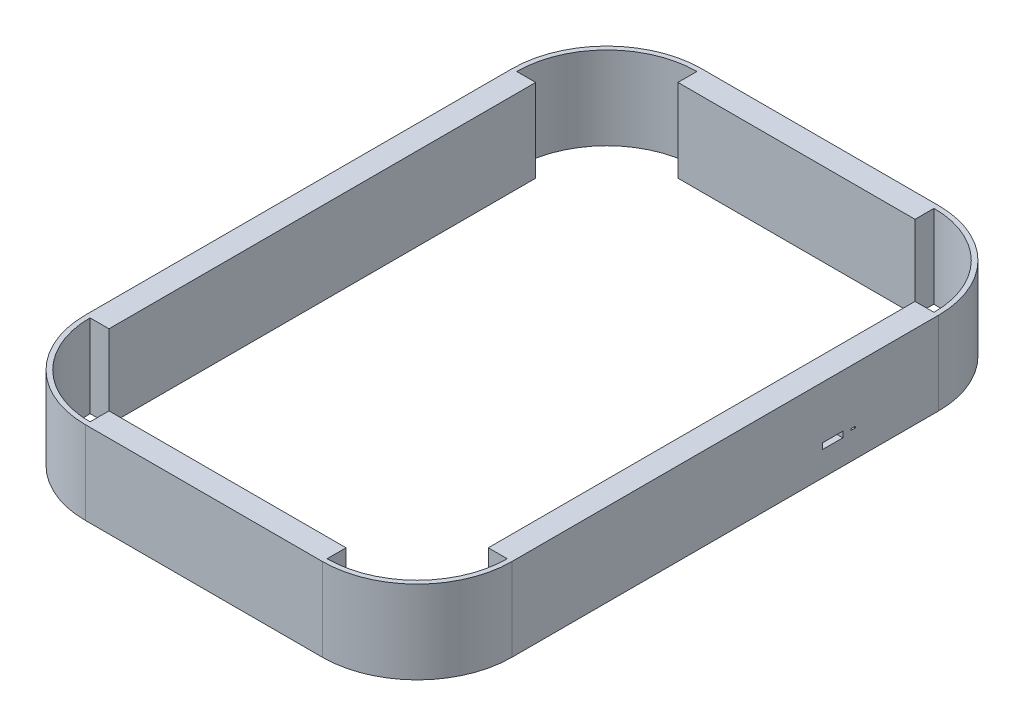
ISO-10303-21;
HEADER;
FILE_DESCRIPTION(('STEP AP214'),'2;1');
FILE_NAME('part.step','',(''),(''),'','','');
FILE_SCHEMA(('AUTOMOTIVE_DESIGN { 1 0 10303 214 1 1 1 1 }'));
ENDSEC;
DATA;
#1=APPLICATION_CONTEXT('core data for automotive mechanical design processes');
#2=APPLICATION_PROTOCOL_DEFINITION('international standard','automotive_design',2000,#1);
#3=PRODUCT_CONTEXT('',#1,'mechanical');
#4=PRODUCT('Part','Part','',(#3));
#5=PRODUCT_RELATED_PRODUCT_CATEGORY('part','',(#4));
#6=PRODUCT_DEFINITION_FORMATION('','',#4);
#7=PRODUCT_DEFINITION_CONTEXT('part definition',#1,'design');
#8=PRODUCT_DEFINITION('design','',#6,#7);
#9=PRODUCT_DEFINITION_SHAPE('','',#8);
#10=(LENGTH_UNIT() NAMED_UNIT(*) SI_UNIT(.MILLI.,.METRE.));
#11=(NAMED_UNIT(*) PLANE_ANGLE_UNIT() SI_UNIT($,.RADIAN.));
#12=(NAMED_UNIT(*) SI_UNIT($,.STERADIAN.) SOLID_ANGLE_UNIT());
#13=UNCERTAINTY_MEASURE_WITH_UNIT(LENGTH_MEASURE(1.E-05),#10,'distance_accuracy_value','');
#14=(GEOMETRIC_REPRESENTATION_CONTEXT(3) GLOBAL_UNCERTAINTY_ASSIGNED_CONTEXT((#13)) GLOBAL_UNIT_ASSIGNED_CONTEXT((#10,
#11,#12)) REPRESENTATION_CONTEXT('',''));
#15=CARTESIAN_POINT('',(0.,0.,0.));
#16=DIRECTION('',(0.,0.,1.));
#17=DIRECTION('',(1.,0.,0.));
#18=AXIS2_PLACEMENT_3D('',#15,#16,#17);
#19=CARTESIAN_POINT('',(-80.,35.,120.));
#20=DIRECTION('',(0.,0.,-1.));
#21=DIRECTION('',(-1.,0.,0.));
#22=AXIS2_PLACEMENT_3D('',#19,#20,#21);
#23=PLANE('',#22);
#24=DIRECTION('',(1.,0.,0.));
#25=VECTOR('',#24,1.);
#26=CARTESIAN_POINT('',(-80.,0.,120.));
#27=LINE('',#26,#25);
#28=CARTESIAN_POINT('',(-50.,0.,120.));
#29=VERTEX_POINT('',#28);
#30=CARTESIAN_POINT('',(50.,0.,120.));
#31=VERTEX_POINT('',#30);
#32=EDGE_CURVE('E400',#29,#31,#27,.T.);
#33=ORIENTED_EDGE('',*,*,#32,.F.);
#34=DIRECTION('',(0.,-1.,0.));
#35=VECTOR('',#34,1.);
#36=CARTESIAN_POINT('',(-50.,35.,120.));
#37=LINE('',#36,#35);
#38=CARTESIAN_POINT('',(-50.,35.,120.));
#39=VERTEX_POINT('',#38);
#40=EDGE_CURVE('E429',#39,#29,#37,.T.);
#41=ORIENTED_EDGE('',*,*,#40,.F.);
#42=DIRECTION('',(1.,0.,0.));
#43=VECTOR('',#42,1.);
#44=CARTESIAN_POINT('',(-80.,35.,120.));
#45=LINE('',#44,#43);
#46=CARTESIAN_POINT('',(50.,35.,120.));
#47=VERTEX_POINT('',#46);
#48=EDGE_CURVE('E403',#39,#47,#45,.T.);
#49=ORIENTED_EDGE('',*,*,#48,.T.);
#50=DIRECTION('',(0.,-1.,0.));
#51=VECTOR('',#50,1.);
#52=CARTESIAN_POINT('',(50.,35.,120.));
#53=LINE('',#52,#51);
#54=EDGE_CURVE('E431',#31,#47,#53,.F.);
#55=ORIENTED_EDGE('',*,*,#54,.F.);
#56=EDGE_LOOP('',(#33,#41,#49,#55));
#57=FACE_BOUND('',#56,.T.);
#58=ADVANCED_FACE('F33',(#57),#23,.T.);
#59=CARTESIAN_POINT('',(-80.,35.,-120.));
#60=DIRECTION('',(1.,0.,0.));
#61=DIRECTION('',(0.,0.,-1.));
#62=AXIS2_PLACEMENT_3D('',#59,#60,#61);
#63=PLANE('',#62);
#64=DIRECTION('',(0.,0.,1.));
#65=VECTOR('',#64,1.);
#66=CARTESIAN_POINT('',(-80.,0.,-120.));
#67=LINE('',#66,#65);
#68=CARTESIAN_POINT('',(-80.,0.,-89.9999999999999));
#69=VERTEX_POINT('',#68);
#70=CARTESIAN_POINT('',(-80.,0.,89.9999999999999));
#71=VERTEX_POINT('',#70);
#72=EDGE_CURVE('E407',#69,#71,#67,.T.);
#73=ORIENTED_EDGE('',*,*,#72,.F.);
#74=DIRECTION('',(0.,-1.,0.));
#75=VECTOR('',#74,1.);
#76=CARTESIAN_POINT('',(-80.,0.,-89.9999999999999));
#77=LINE('',#76,#75);
#78=CARTESIAN_POINT('',(-80.,35.,-89.9999999999999));
#79=VERTEX_POINT('',#78);
#80=EDGE_CURVE('E433',#79,#69,#77,.T.);
#81=ORIENTED_EDGE('',*,*,#80,.F.);
#82=DIRECTION('',(0.,0.,1.));
#83=VECTOR('',#82,1.);
#84=CARTESIAN_POINT('',(-80.,35.,-120.));
#85=LINE('',#84,#83);
#86=CARTESIAN_POINT('',(-80.,35.,89.9999999999999));
#87=VERTEX_POINT('',#86);
#88=EDGE_CURVE('E413',#79,#87,#85,.T.);
#89=ORIENTED_EDGE('',*,*,#88,.T.);
#90=DIRECTION('',(0.,-1.,0.));
#91=VECTOR('',#90,1.);
#92=CARTESIAN_POINT('',(-80.,35.,90.0000000000001));
#93=LINE('',#92,#91);
#94=EDGE_CURVE('E435',#71,#87,#93,.F.);
#95=ORIENTED_EDGE('',*,*,#94,.F.);
#96=EDGE_LOOP('',(#73,#81,#89,#95));
#97=FACE_BOUND('',#96,.T.);
#98=ADVANCED_FACE('F542',(#97),#63,.T.);
#99=CARTESIAN_POINT('',(-80.,35.,-120.));
#100=DIRECTION('',(0.,0.,-1.));
#101=DIRECTION('',(-1.,0.,0.));
#102=AXIS2_PLACEMENT_3D('',#99,#100,#101);
#103=PLANE('',#102);
#104=DIRECTION('',(1.,0.,0.));
#105=VECTOR('',#104,1.);
#106=CARTESIAN_POINT('',(-80.,0.,-120.));
#107=LINE('',#106,#105);
#108=CARTESIAN_POINT('',(-50.,0.,-120.));
#109=VERTEX_POINT('',#108);
#110=CARTESIAN_POINT('',(50.,0.,-120.));
#111=VERTEX_POINT('',#110);
#112=EDGE_CURVE('E422',#109,#111,#107,.T.);
#113=ORIENTED_EDGE('',*,*,#112,.T.);
#114=DIRECTION('',(0.,-1.,0.));
#115=VECTOR('',#114,1.);
#116=CARTESIAN_POINT('',(50.,35.,-120.));
#117=LINE('',#116,#115);
#118=CARTESIAN_POINT('',(50.,35.,-120.));
#119=VERTEX_POINT('',#118);
#120=EDGE_CURVE('E256',#119,#111,#117,.T.);
#121=ORIENTED_EDGE('',*,*,#120,.F.);
#122=DIRECTION('',(1.,0.,0.));
#123=VECTOR('',#122,1.);
#124=CARTESIAN_POINT('',(-80.,35.,-120.));
#125=LINE('',#124,#123);
#126=CARTESIAN_POINT('',(-50.,35.,-120.));
#127=VERTEX_POINT('',#126);
#128=EDGE_CURVE('E410',#127,#119,#125,.T.);
#129=ORIENTED_EDGE('',*,*,#128,.F.);
#130=DIRECTION('',(0.,-1.,0.));
#131=VECTOR('',#130,1.);
#132=CARTESIAN_POINT('',(-50.,35.,-120.));
#133=LINE('',#132,#131);
#134=EDGE_CURVE('E438',#109,#127,#133,.F.);
#135=ORIENTED_EDGE('',*,*,#134,.F.);
#136=EDGE_LOOP('',(#113,#121,#129,#135));
#137=FACE_BOUND('',#136,.T.);
#138=ADVANCED_FACE('F550',(#137),#103,.F.);
#139=CARTESIAN_POINT('',(80.,35.,-120.));
#140=DIRECTION('',(1.,0.,0.));
#141=DIRECTION('',(0.,0.,-1.));
#142=AXIS2_PLACEMENT_3D('',#139,#140,#141);
#143=PLANE('',#142);
#144=DIRECTION('',(0.,-1.,0.));
#145=VECTOR('',#144,1.);
#146=CARTESIAN_POINT('',(80.,11.3714247821758,-54.8002294925989));
#147=LINE('',#146,#145);
#148=CARTESIAN_POINT('',(80.,11.9978500439825,-54.8002294925989));
#149=VERTEX_POINT('',#148);
#150=CARTESIAN_POINT('',(80.,11.3714247821758,-54.8002294925989));
#151=VERTEX_POINT('',#150);
#152=EDGE_CURVE('E350',#149,#151,#147,.T.);
#153=ORIENTED_EDGE('',*,*,#152,.F.);
#154=DIRECTION('',(0.,0.,1.));
#155=VECTOR('',#154,1.);
#156=CARTESIAN_POINT('',(80.,11.9978500439825,-52.7922595868859));
#157=LINE('',#156,#155);
#158=CARTESIAN_POINT('',(80.,11.9978500439825,-52.9039174641297));
#159=VERTEX_POINT('',#158);
#160=EDGE_CURVE('E366',#149,#159,#157,.T.);
#161=ORIENTED_EDGE('',*,*,#160,.T.);
#162=DIRECTION('',(0.,1.,0.));
#163=VECTOR('',#162,1.);
#164=CARTESIAN_POINT('',(80.,11.3714247821758,-52.9039174641297));
#165=LINE('',#164,#163);
#166=CARTESIAN_POINT('',(80.,11.3714247821758,-52.9039174641297));
#167=VERTEX_POINT('',#166);
#168=EDGE_CURVE('E340',#167,#159,#165,.T.);
#169=ORIENTED_EDGE('',*,*,#168,.F.);
#170=DIRECTION('',(0.,0.,1.));
#171=VECTOR('',#170,1.);
#172=CARTESIAN_POINT('',(80.,11.3714247821758,-52.7922595868859));
#173=LINE('',#172,#171);
#174=EDGE_CURVE('E360',#151,#167,#173,.T.);
#175=ORIENTED_EDGE('',*,*,#174,.F.);
#176=EDGE_LOOP('',(#153,#161,#169,#175));
#177=FACE_BOUND('',#176,.T.);
#178=DIRECTION('',(0.,1.,0.));
#179=VECTOR('',#178,1.);
#180=CARTESIAN_POINT('',(80.,12.8301471697179,-41.037153547045));
#181=LINE('',#180,#179);
#182=CARTESIAN_POINT('',(80.,10.3994004696813,-41.037153547045));
#183=VERTEX_POINT('',#182);
#184=CARTESIAN_POINT('',(80.,12.8301471697179,-41.037153547045));
#185=VERTEX_POINT('',#184);
#186=EDGE_CURVE('E379',#183,#185,#181,.T.);
#187=ORIENTED_EDGE('',*,*,#186,.F.);
#188=DIRECTION('',(0.,0.,1.));
#189=VECTOR('',#188,1.);
#190=CARTESIAN_POINT('',(80.,10.3994004696813,-41.037153547045));
#191=LINE('',#190,#189);
#192=CARTESIAN_POINT('',(80.,10.3994004696813,-49.537153547045));
#193=VERTEX_POINT('',#192);
#194=EDGE_CURVE('E372',#193,#183,#191,.T.);
#195=ORIENTED_EDGE('',*,*,#194,.F.);
#196=DIRECTION('',(0.,-1.,0.));
#197=VECTOR('',#196,1.);
#198=CARTESIAN_POINT('',(80.,12.8301471697179,-49.537153547045));
#199=LINE('',#198,#197);
#200=CARTESIAN_POINT('',(80.,12.8301471697179,-49.537153547045));
#201=VERTEX_POINT('',#200);
#202=EDGE_CURVE('E385',#201,#193,#199,.T.);
#203=ORIENTED_EDGE('',*,*,#202,.F.);
#204=DIRECTION('',(0.,0.,-1.));
#205=VECTOR('',#204,1.);
#206=CARTESIAN_POINT('',(80.,12.8301471697179,-49.537153547045));
#207=LINE('',#206,#205);
#208=EDGE_CURVE('E393',#185,#201,#207,.T.);
#209=ORIENTED_EDGE('',*,*,#208,.F.);
#210=EDGE_LOOP('',(#187,#195,#203,#209));
#211=FACE_BOUND('',#210,.T.);
#212=DIRECTION('',(0.,0.,1.));
#213=VECTOR('',#212,1.);
#214=CARTESIAN_POINT('',(80.,35.,-120.));
#215=LINE('',#214,#213);
#216=CARTESIAN_POINT('',(80.,35.,-89.9999999999999));
#217=VERTEX_POINT('',#216);
#218=CARTESIAN_POINT('',(80.,35.,89.9999999999999));
#219=VERTEX_POINT('',#218);
#220=EDGE_CURVE('E406',#217,#219,#215,.T.);
#221=ORIENTED_EDGE('',*,*,#220,.F.);
#222=DIRECTION('',(0.,-1.,0.));
#223=VECTOR('',#222,1.);
#224=CARTESIAN_POINT('',(80.,35.,-89.9999999999999));
#225=LINE('',#224,#223);
#226=CARTESIAN_POINT('',(80.,0.,-89.9999999999999));
#227=VERTEX_POINT('',#226);
#228=EDGE_CURVE('E416',#227,#217,#225,.F.);
#229=ORIENTED_EDGE('',*,*,#228,.F.);
#230=DIRECTION('',(0.,0.,1.));
#231=VECTOR('',#230,1.);
#232=CARTESIAN_POINT('',(80.,0.,-120.));
#233=LINE('',#232,#231);
#234=CARTESIAN_POINT('',(80.,0.,89.9999999999999));
#235=VERTEX_POINT('',#234);
#236=EDGE_CURVE('E419',#227,#235,#233,.T.);
#237=ORIENTED_EDGE('',*,*,#236,.T.);
#238=DIRECTION('',(0.,-1.,0.));
#239=VECTOR('',#238,1.);
#240=CARTESIAN_POINT('',(80.,0.,90.0000000000001));
#241=LINE('',#240,#239);
#242=EDGE_CURVE('E427',#219,#235,#241,.T.);
#243=ORIENTED_EDGE('',*,*,#242,.F.);
#244=EDGE_LOOP('',(#221,#229,#237,#243));
#245=FACE_BOUND('',#244,.T.);
#246=ADVANCED_FACE('F556',(#177,#211,#245),#143,.F.);
#247=CARTESIAN_POINT('',(0.,0.,0.));
#248=DIRECTION('',(0.,-1.,0.));
#249=DIRECTION('',(0.,0.,-1.));
#250=AXIS2_PLACEMENT_3D('',#247,#248,#249);
#251=PLANE('',#250);
#252=DIRECTION('',(1.,0.,0.));
#253=VECTOR('',#252,1.);
#254=CARTESIAN_POINT('',(80.,0.,-89.9999999999999));
#255=LINE('',#254,#253);
#256=CARTESIAN_POINT('',(88.,0.,-89.9999999999999));
#257=VERTEX_POINT('',#256);
#258=EDGE_CURVE('E265',#227,#257,#255,.T.);
#259=ORIENTED_EDGE('',*,*,#258,.T.);
#260=CARTESIAN_POINT('',(50.,0.,-89.9999999999999));
#261=DIRECTION('',(0.,-1.,0.));
#262=DIRECTION('',(0.,0.,-1.));
#263=AXIS2_PLACEMENT_3D('',#260,#261,#262);
#264=CIRCLE('',#263,38.);
#265=CARTESIAN_POINT('',(50.,0.,-128.));
#266=VERTEX_POINT('',#265);
#267=EDGE_CURVE('E245',#266,#257,#264,.T.);
#268=ORIENTED_EDGE('',*,*,#267,.F.);
#269=DIRECTION('',(0.,0.,-1.));
#270=VECTOR('',#269,1.);
#271=CARTESIAN_POINT('',(50.,0.,-120.));
#272=LINE('',#271,#270);
#273=EDGE_CURVE('E253',#111,#266,#272,.T.);
#274=ORIENTED_EDGE('',*,*,#273,.F.);
#275=ORIENTED_EDGE('',*,*,#112,.F.);
#276=DIRECTION('',(0.,0.,-1.));
#277=VECTOR('',#276,1.);
#278=CARTESIAN_POINT('',(-50.,0.,-120.));
#279=LINE('',#278,#277);
#280=CARTESIAN_POINT('',(-50.,0.,-128.));
#281=VERTEX_POINT('',#280);
#282=EDGE_CURVE('E320',#109,#281,#279,.T.);
#283=ORIENTED_EDGE('',*,*,#282,.T.);
#284=CARTESIAN_POINT('',(-50.,0.,-89.9999999999999));
#285=DIRECTION('',(0.,-1.,0.));
#286=DIRECTION('',(0.,0.,-1.));
#287=AXIS2_PLACEMENT_3D('',#284,#285,#286);
#288=CIRCLE('',#287,38.);
#289=CARTESIAN_POINT('',(-88.,0.,-89.9999999999999));
#290=VERTEX_POINT('',#289);
#291=EDGE_CURVE('E317',#281,#290,#288,.F.);
#292=ORIENTED_EDGE('',*,*,#291,.T.);
#293=DIRECTION('',(-1.,0.,0.));
#294=VECTOR('',#293,1.);
#295=CARTESIAN_POINT('',(-80.,0.,-89.9999999999999));
#296=LINE('',#295,#294);
#297=EDGE_CURVE('E334',#69,#290,#296,.T.);
#298=ORIENTED_EDGE('',*,*,#297,.F.);
#299=ORIENTED_EDGE('',*,*,#72,.T.);
#300=DIRECTION('',(-1.,0.,0.));
#301=VECTOR('',#300,1.);
#302=CARTESIAN_POINT('',(-80.,0.,89.9999999999999));
#303=LINE('',#302,#301);
#304=CARTESIAN_POINT('',(-88.,0.,89.9999999999999));
#305=VERTEX_POINT('',#304);
#306=EDGE_CURVE('E297',#71,#305,#303,.T.);
#307=ORIENTED_EDGE('',*,*,#306,.T.);
#308=CARTESIAN_POINT('',(-50.,0.,89.9999999999999));
#309=DIRECTION('',(0.,-1.,0.));
#310=DIRECTION('',(0.,0.,-1.));
#311=AXIS2_PLACEMENT_3D('',#308,#309,#310);
#312=CIRCLE('',#311,38.);
#313=CARTESIAN_POINT('',(-50.,0.,128.));
#314=VERTEX_POINT('',#313);
#315=EDGE_CURVE('E294',#314,#305,#312,.T.);
#316=ORIENTED_EDGE('',*,*,#315,.F.);
#317=DIRECTION('',(0.,0.,1.));
#318=VECTOR('',#317,1.);
#319=CARTESIAN_POINT('',(-50.,0.,120.));
#320=LINE('',#319,#318);
#321=EDGE_CURVE('E312',#29,#314,#320,.T.);
#322=ORIENTED_EDGE('',*,*,#321,.F.);
#323=ORIENTED_EDGE('',*,*,#32,.T.);
#324=DIRECTION('',(0.,0.,1.));
#325=VECTOR('',#324,1.);
#326=CARTESIAN_POINT('',(50.,0.,120.));
#327=LINE('',#326,#325);
#328=CARTESIAN_POINT('',(50.,0.,128.));
#329=VERTEX_POINT('',#328);
#330=EDGE_CURVE('E277',#31,#329,#327,.T.);
#331=ORIENTED_EDGE('',*,*,#330,.T.);
#332=CARTESIAN_POINT('',(50.,0.,89.9999999999999));
#333=DIRECTION('',(0.,-1.,0.));
#334=DIRECTION('',(0.,0.,-1.));
#335=AXIS2_PLACEMENT_3D('',#332,#333,#334);
#336=CIRCLE('',#335,38.);
#337=CARTESIAN_POINT('',(88.,0.,89.9999999999999));
#338=VERTEX_POINT('',#337);
#339=EDGE_CURVE('E260',#329,#338,#336,.F.);
#340=ORIENTED_EDGE('',*,*,#339,.T.);
#341=DIRECTION('',(1.,0.,0.));
#342=VECTOR('',#341,1.);
#343=CARTESIAN_POINT('',(80.,0.,89.9999999999999));
#344=LINE('',#343,#342);
#345=EDGE_CURVE('E290',#235,#338,#344,.T.);
#346=ORIENTED_EDGE('',*,*,#345,.F.);
#347=ORIENTED_EDGE('',*,*,#236,.F.);
#348=EDGE_LOOP('',(#259,#268,#274,#275,#283,#292,#298,#299,#307,#316,#322,#323,#331,#340,#346,#347));
#349=FACE_BOUND('',#348,.T.);
#350=DIRECTION('',(0.,0.,1.));
#351=VECTOR('',#350,1.);
#352=CARTESIAN_POINT('',(90.,0.,0.));
#353=LINE('',#352,#351);
#354=CARTESIAN_POINT('',(90.,0.,-89.9999999999999));
#355=VERTEX_POINT('',#354);
#356=CARTESIAN_POINT('',(90.,0.,90.0000000000001));
#357=VERTEX_POINT('',#356);
#358=EDGE_CURVE('E465',#355,#357,#353,.T.);
#359=ORIENTED_EDGE('',*,*,#358,.T.);
#360=CARTESIAN_POINT('',(50.,0.,90.0000000000001));
#361=DIRECTION('',(0.,-1.,0.));
#362=DIRECTION('',(0.,0.,-1.));
#363=AXIS2_PLACEMENT_3D('',#360,#361,#362);
#364=CIRCLE('',#363,40.);
#365=CARTESIAN_POINT('',(50.,0.,130.));
#366=VERTEX_POINT('',#365);
#367=EDGE_CURVE('E447',#357,#366,#364,.T.);
#368=ORIENTED_EDGE('',*,*,#367,.T.);
#369=DIRECTION('',(1.,0.,0.));
#370=VECTOR('',#369,1.);
#371=CARTESIAN_POINT('',(0.,0.,130.));
#372=LINE('',#371,#370);
#373=CARTESIAN_POINT('',(-50.,0.,130.));
#374=VERTEX_POINT('',#373);
#375=EDGE_CURVE('E440',#374,#366,#372,.T.);
#376=ORIENTED_EDGE('',*,*,#375,.F.);
#377=CARTESIAN_POINT('',(-50.,0.,90.0000000000001));
#378=DIRECTION('',(0.,-1.,0.));
#379=DIRECTION('',(0.,0.,-1.));
#380=AXIS2_PLACEMENT_3D('',#377,#378,#379);
#381=CIRCLE('',#380,40.);
#382=CARTESIAN_POINT('',(-90.,0.,90.0000000000001));
#383=VERTEX_POINT('',#382);
#384=EDGE_CURVE('E466',#374,#383,#381,.T.);
#385=ORIENTED_EDGE('',*,*,#384,.T.);
#386=DIRECTION('',(0.,0.,1.));
#387=VECTOR('',#386,1.);
#388=CARTESIAN_POINT('',(-90.,0.,0.));
#389=LINE('',#388,#387);
#390=CARTESIAN_POINT('',(-90.,0.,-90.));
#391=VERTEX_POINT('',#390);
#392=EDGE_CURVE('E469',#391,#383,#389,.T.);
#393=ORIENTED_EDGE('',*,*,#392,.F.);
#394=CARTESIAN_POINT('',(-50.,0.,-89.9999999999999));
#395=DIRECTION('',(0.,-1.,0.));
#396=DIRECTION('',(0.,0.,-1.));
#397=AXIS2_PLACEMENT_3D('',#394,#395,#396);
#398=CIRCLE('',#397,40.);
#399=CARTESIAN_POINT('',(-50.,0.,-130.));
#400=VERTEX_POINT('',#399);
#401=EDGE_CURVE('E468',#391,#400,#398,.T.);
#402=ORIENTED_EDGE('',*,*,#401,.T.);
#403=DIRECTION('',(1.,0.,0.));
#404=VECTOR('',#403,1.);
#405=CARTESIAN_POINT('',(0.,0.,-130.));
#406=LINE('',#405,#404);
#407=CARTESIAN_POINT('',(50.,0.,-130.));
#408=VERTEX_POINT('',#407);
#409=EDGE_CURVE('E473',#400,#408,#406,.T.);
#410=ORIENTED_EDGE('',*,*,#409,.T.);
#411=CARTESIAN_POINT('',(50.,0.,-89.9999999999999));
#412=DIRECTION('',(0.,-1.,0.));
#413=DIRECTION('',(0.,0.,-1.));
#414=AXIS2_PLACEMENT_3D('',#411,#412,#413);
#415=CIRCLE('',#414,40.);
#416=EDGE_CURVE('E451',#408,#355,#415,.T.);
#417=ORIENTED_EDGE('',*,*,#416,.T.);
#418=EDGE_LOOP('',(#359,#368,#376,#385,#393,#402,#410,#417));
#419=FACE_BOUND('',#418,.T.);
#420=ADVANCED_FACE('F262',(#349,#419),#251,.T.);
#421=CARTESIAN_POINT('',(0.,35.,0.));
#422=DIRECTION('',(0.,-1.,0.));
#423=DIRECTION('',(0.,0.,-1.));
#424=AXIS2_PLACEMENT_3D('',#421,#422,#423);
#425=PLANE('',#424);
#426=CARTESIAN_POINT('',(50.,35.,-89.9999999999999));
#427=DIRECTION('',(0.,-1.,0.));
#428=DIRECTION('',(0.,0.,1.));
#429=AXIS2_PLACEMENT_3D('',#426,#427,#428);
#430=CIRCLE('',#429,38.);
#431=CARTESIAN_POINT('',(50.,35.,-128.));
#432=VERTEX_POINT('',#431);
#433=CARTESIAN_POINT('',(88.,35.,-89.9999999999999));
#434=VERTEX_POINT('',#433);
#435=EDGE_CURVE('E50',#432,#434,#430,.T.);
#436=ORIENTED_EDGE('',*,*,#435,.T.);
#437=DIRECTION('',(1.,0.,0.));
#438=VECTOR('',#437,1.);
#439=CARTESIAN_POINT('',(80.,35.,-89.9999999999999));
#440=LINE('',#439,#438);
#441=EDGE_CURVE('E250',#217,#434,#440,.T.);
#442=ORIENTED_EDGE('',*,*,#441,.F.);
#443=ORIENTED_EDGE('',*,*,#220,.T.);
#444=DIRECTION('',(1.,0.,0.));
#445=VECTOR('',#444,1.);
#446=CARTESIAN_POINT('',(80.,35.,89.9999999999999));
#447=LINE('',#446,#445);
#448=CARTESIAN_POINT('',(88.,35.,89.9999999999999));
#449=VERTEX_POINT('',#448);
#450=EDGE_CURVE('E281',#219,#449,#447,.T.);
#451=ORIENTED_EDGE('',*,*,#450,.T.);
#452=CARTESIAN_POINT('',(50.,35.,89.9999999999999));
#453=DIRECTION('',(0.,1.,0.));
#454=DIRECTION('',(0.,0.,-1.));
#455=AXIS2_PLACEMENT_3D('',#452,#453,#454);
#456=CIRCLE('',#455,38.);
#457=CARTESIAN_POINT('',(50.,35.,128.));
#458=VERTEX_POINT('',#457);
#459=EDGE_CURVE('E58',#458,#449,#456,.T.);
#460=ORIENTED_EDGE('',*,*,#459,.F.);
#461=DIRECTION('',(0.,0.,1.));
#462=VECTOR('',#461,1.);
#463=CARTESIAN_POINT('',(50.,35.,120.));
#464=LINE('',#463,#462);
#465=EDGE_CURVE('E284',#47,#458,#464,.T.);
#466=ORIENTED_EDGE('',*,*,#465,.F.);
#467=ORIENTED_EDGE('',*,*,#48,.F.);
#468=DIRECTION('',(0.,0.,1.));
#469=VECTOR('',#468,1.);
#470=CARTESIAN_POINT('',(-50.,35.,120.));
#471=LINE('',#470,#469);
#472=CARTESIAN_POINT('',(-50.,35.,128.));
#473=VERTEX_POINT('',#472);
#474=EDGE_CURVE('E303',#39,#473,#471,.T.);
#475=ORIENTED_EDGE('',*,*,#474,.T.);
#476=CARTESIAN_POINT('',(-50.,35.,89.9999999999999));
#477=DIRECTION('',(0.,-1.,0.));
#478=DIRECTION('',(0.,0.,-1.));
#479=AXIS2_PLACEMENT_3D('',#476,#477,#478);
#480=CIRCLE('',#479,38.);
#481=CARTESIAN_POINT('',(-88.,35.,89.9999999999999));
#482=VERTEX_POINT('',#481);
#483=EDGE_CURVE('E300',#473,#482,#480,.T.);
#484=ORIENTED_EDGE('',*,*,#483,.T.);
#485=DIRECTION('',(-1.,0.,0.));
#486=VECTOR('',#485,1.);
#487=CARTESIAN_POINT('',(-80.,35.,89.9999999999999));
#488=LINE('',#487,#486);
#489=EDGE_CURVE('E306',#87,#482,#488,.T.);
#490=ORIENTED_EDGE('',*,*,#489,.F.);
#491=ORIENTED_EDGE('',*,*,#88,.F.);
#492=DIRECTION('',(-1.,0.,0.));
#493=VECTOR('',#492,1.);
#494=CARTESIAN_POINT('',(-80.,35.,-89.9999999999999));
#495=LINE('',#494,#493);
#496=CARTESIAN_POINT('',(-88.,35.,-89.9999999999999));
#497=VERTEX_POINT('',#496);
#498=EDGE_CURVE('E325',#79,#497,#495,.T.);
#499=ORIENTED_EDGE('',*,*,#498,.T.);
#500=CARTESIAN_POINT('',(-50.,35.,-89.9999999999999));
#501=DIRECTION('',(0.,1.,0.));
#502=DIRECTION('',(0.,0.,1.));
#503=AXIS2_PLACEMENT_3D('',#500,#501,#502);
#504=CIRCLE('',#503,38.);
#505=CARTESIAN_POINT('',(-50.,35.,-128.));
#506=VERTEX_POINT('',#505);
#507=EDGE_CURVE('E323',#506,#497,#504,.T.);
#508=ORIENTED_EDGE('',*,*,#507,.F.);
#509=DIRECTION('',(0.,0.,-1.));
#510=VECTOR('',#509,1.);
#511=CARTESIAN_POINT('',(-50.,35.,-120.));
#512=LINE('',#511,#510);
#513=EDGE_CURVE('E328',#127,#506,#512,.T.);
#514=ORIENTED_EDGE('',*,*,#513,.F.);
#515=ORIENTED_EDGE('',*,*,#128,.T.);
#516=DIRECTION('',(0.,0.,-1.));
#517=VECTOR('',#516,1.);
#518=CARTESIAN_POINT('',(50.,35.,-120.));
#519=LINE('',#518,#517);
#520=EDGE_CURVE('E270',#119,#432,#519,.T.);
#521=ORIENTED_EDGE('',*,*,#520,.T.);
#522=EDGE_LOOP('',(#436,#442,#443,#451,#460,#466,#467,#475,#484,#490,#491,#499,#508,#514,#515,#521));
#523=FACE_BOUND('',#522,.T.);
#524=DIRECTION('',(1.,0.,0.));
#525=VECTOR('',#524,1.);
#526=CARTESIAN_POINT('',(0.,35.,130.));
#527=LINE('',#526,#525);
#528=CARTESIAN_POINT('',(-50.,35.,130.));
#529=VERTEX_POINT('',#528);
#530=CARTESIAN_POINT('',(50.,35.,130.));
#531=VERTEX_POINT('',#530);
#532=EDGE_CURVE('E472',#529,#531,#527,.T.);
#533=ORIENTED_EDGE('',*,*,#532,.T.);
#534=CARTESIAN_POINT('',(50.,35.,90.0000000000001));
#535=DIRECTION('',(0.,-1.,0.));
#536=DIRECTION('',(0.,0.,-1.));
#537=AXIS2_PLACEMENT_3D('',#534,#535,#536);
#538=CIRCLE('',#537,40.);
#539=CARTESIAN_POINT('',(90.,35.,90.0000000000001));
#540=VERTEX_POINT('',#539);
#541=EDGE_CURVE('E461',#531,#540,#538,.F.);
#542=ORIENTED_EDGE('',*,*,#541,.T.);
#543=DIRECTION('',(0.,0.,1.));
#544=VECTOR('',#543,1.);
#545=CARTESIAN_POINT('',(90.,35.,0.));
#546=LINE('',#545,#544);
#547=CARTESIAN_POINT('',(90.,35.,-89.9999999999999));
#548=VERTEX_POINT('',#547);
#549=EDGE_CURVE('E483',#548,#540,#546,.T.);
#550=ORIENTED_EDGE('',*,*,#549,.F.);
#551=CARTESIAN_POINT('',(50.,35.,-89.9999999999999));
#552=DIRECTION('',(0.,-1.,0.));
#553=DIRECTION('',(0.,0.,-1.));
#554=AXIS2_PLACEMENT_3D('',#551,#552,#553);
#555=CIRCLE('',#554,40.);
#556=CARTESIAN_POINT('',(50.,35.,-130.));
#557=VERTEX_POINT('',#556);
#558=EDGE_CURVE('E443',#548,#557,#555,.F.);
#559=ORIENTED_EDGE('',*,*,#558,.T.);
#560=DIRECTION('',(1.,0.,0.));
#561=VECTOR('',#560,1.);
#562=CARTESIAN_POINT('',(0.,35.,-130.));
#563=LINE('',#562,#561);
#564=CARTESIAN_POINT('',(-50.,35.,-130.));
#565=VERTEX_POINT('',#564);
#566=EDGE_CURVE('E487',#565,#557,#563,.T.);
#567=ORIENTED_EDGE('',*,*,#566,.F.);
#568=CARTESIAN_POINT('',(-50.,35.,-89.9999999999999));
#569=DIRECTION('',(0.,-1.,0.));
#570=DIRECTION('',(0.,0.,-1.));
#571=AXIS2_PLACEMENT_3D('',#568,#569,#570);
#572=CIRCLE('',#571,40.);
#573=CARTESIAN_POINT('',(-90.,35.,-89.9999999999999));
#574=VERTEX_POINT('',#573);
#575=EDGE_CURVE('E489',#565,#574,#572,.F.);
#576=ORIENTED_EDGE('',*,*,#575,.T.);
#577=DIRECTION('',(0.,0.,1.));
#578=VECTOR('',#577,1.);
#579=CARTESIAN_POINT('',(-90.,35.,0.));
#580=LINE('',#579,#578);
#581=CARTESIAN_POINT('',(-90.,35.,90.0000000000001));
#582=VERTEX_POINT('',#581);
#583=EDGE_CURVE('E454',#574,#582,#580,.T.);
#584=ORIENTED_EDGE('',*,*,#583,.T.);
#585=CARTESIAN_POINT('',(-50.,35.,90.0000000000001));
#586=DIRECTION('',(0.,-1.,0.));
#587=DIRECTION('',(0.,0.,-1.));
#588=AXIS2_PLACEMENT_3D('',#585,#586,#587);
#589=CIRCLE('',#588,40.);
#590=EDGE_CURVE('E37',#582,#529,#589,.F.);
#591=ORIENTED_EDGE('',*,*,#590,.T.);
#592=EDGE_LOOP('',(#533,#542,#550,#559,#567,#576,#584,#591));
#593=FACE_BOUND('',#592,.T.);
#594=ADVANCED_FACE('F496',(#523,#593),#425,.F.);
#595=CARTESIAN_POINT('',(50.,35.,-89.9999999999999));
#596=DIRECTION('',(0.,-1.,0.));
#597=DIRECTION('',(0.,0.,-1.));
#598=AXIS2_PLACEMENT_3D('',#595,#596,#597);
#599=CYLINDRICAL_SURFACE('',#598,40.);
#600=ORIENTED_EDGE('',*,*,#558,.F.);
#601=DIRECTION('',(0.,1.,0.));
#602=VECTOR('',#601,1.);
#603=CARTESIAN_POINT('',(90.,35.,-89.9999999999999));
#604=LINE('',#603,#602);
#605=EDGE_CURVE('E452',#355,#548,#604,.T.);
#606=ORIENTED_EDGE('',*,*,#605,.F.);
#607=ORIENTED_EDGE('',*,*,#416,.F.);
#608=DIRECTION('',(0.,1.,0.));
#609=VECTOR('',#608,1.);
#610=CARTESIAN_POINT('',(50.,35.,-130.));
#611=LINE('',#610,#609);
#612=EDGE_CURVE('E42',#557,#408,#611,.F.);
#613=ORIENTED_EDGE('',*,*,#612,.F.);
#614=EDGE_LOOP('',(#600,#606,#607,#613));
#615=FACE_BOUND('',#614,.T.);
#616=ADVANCED_FACE('F35',(#615),#599,.T.);
#617=CARTESIAN_POINT('',(-50.,35.,-89.9999999999999));
#618=DIRECTION('',(0.,1.,0.));
#619=DIRECTION('',(0.,0.,1.));
#620=AXIS2_PLACEMENT_3D('',#617,#618,#619);
#621=CYLINDRICAL_SURFACE('',#620,40.);
#622=ORIENTED_EDGE('',*,*,#575,.F.);
#623=DIRECTION('',(0.,1.,0.));
#624=VECTOR('',#623,1.);
#625=CARTESIAN_POINT('',(-50.,35.,-130.));
#626=LINE('',#625,#624);
#627=EDGE_CURVE('E11',#400,#565,#626,.T.);
#628=ORIENTED_EDGE('',*,*,#627,.F.);
#629=ORIENTED_EDGE('',*,*,#401,.F.);
#630=DIRECTION('',(0.,1.,0.));
#631=VECTOR('',#630,1.);
#632=CARTESIAN_POINT('',(-90.,35.,-89.9999999999999));
#633=LINE('',#632,#631);
#634=EDGE_CURVE('E458',#574,#391,#633,.F.);
#635=ORIENTED_EDGE('',*,*,#634,.F.);
#636=EDGE_LOOP('',(#622,#628,#629,#635));
#637=FACE_BOUND('',#636,.T.);
#638=ADVANCED_FACE('F528',(#637),#621,.T.);
#639=CARTESIAN_POINT('',(-50.,35.,90.0000000000001));
#640=DIRECTION('',(0.,-1.,0.));
#641=DIRECTION('',(0.,0.,-1.));
#642=AXIS2_PLACEMENT_3D('',#639,#640,#641);
#643=CYLINDRICAL_SURFACE('',#642,40.);
#644=ORIENTED_EDGE('',*,*,#590,.F.);
#645=DIRECTION('',(0.,1.,0.));
#646=VECTOR('',#645,1.);
#647=CARTESIAN_POINT('',(-90.,35.,90.0000000000001));
#648=LINE('',#647,#646);
#649=EDGE_CURVE('E456',#383,#582,#648,.T.);
#650=ORIENTED_EDGE('',*,*,#649,.F.);
#651=ORIENTED_EDGE('',*,*,#384,.F.);
#652=DIRECTION('',(0.,1.,0.));
#653=VECTOR('',#652,1.);
#654=CARTESIAN_POINT('',(-50.,35.,130.));
#655=LINE('',#654,#653);
#656=EDGE_CURVE('E444',#529,#374,#655,.F.);
#657=ORIENTED_EDGE('',*,*,#656,.F.);
#658=EDGE_LOOP('',(#644,#650,#651,#657));
#659=FACE_BOUND('',#658,.T.);
#660=ADVANCED_FACE('F505',(#659),#643,.T.);
#661=CARTESIAN_POINT('',(50.,35.,90.0000000000001));
#662=DIRECTION('',(0.,1.,0.));
#663=DIRECTION('',(0.,0.,1.));
#664=AXIS2_PLACEMENT_3D('',#661,#662,#663);
#665=CYLINDRICAL_SURFACE('',#664,40.);
#666=ORIENTED_EDGE('',*,*,#541,.F.);
#667=DIRECTION('',(0.,1.,0.));
#668=VECTOR('',#667,1.);
#669=CARTESIAN_POINT('',(50.,35.,130.));
#670=LINE('',#669,#668);
#671=EDGE_CURVE('E441',#366,#531,#670,.T.);
#672=ORIENTED_EDGE('',*,*,#671,.F.);
#673=ORIENTED_EDGE('',*,*,#367,.F.);
#674=DIRECTION('',(0.,1.,0.));
#675=VECTOR('',#674,1.);
#676=CARTESIAN_POINT('',(90.,35.,90.0000000000001));
#677=LINE('',#676,#675);
#678=EDGE_CURVE('E448',#540,#357,#677,.F.);
#679=ORIENTED_EDGE('',*,*,#678,.F.);
#680=EDGE_LOOP('',(#666,#672,#673,#679));
#681=FACE_BOUND('',#680,.T.);
#682=ADVANCED_FACE('F515',(#681),#665,.T.);
#683=CARTESIAN_POINT('',(90.,35.,-120.));
#684=DIRECTION('',(1.,0.,0.));
#685=DIRECTION('',(0.,0.,-1.));
#686=AXIS2_PLACEMENT_3D('',#683,#684,#685);
#687=PLANE('',#686);
#688=DIRECTION('',(0.,0.,1.));
#689=VECTOR('',#688,1.);
#690=CARTESIAN_POINT('',(90.,11.9978500439825,-52.7922595868859));
#691=LINE('',#690,#689);
#692=CARTESIAN_POINT('',(90.,11.9978500439825,-54.8002294925989));
#693=VERTEX_POINT('',#692);
#694=CARTESIAN_POINT('',(90.,11.9978500439825,-52.9039174641297));
#695=VERTEX_POINT('',#694);
#696=EDGE_CURVE('E363',#693,#695,#691,.T.);
#697=ORIENTED_EDGE('',*,*,#696,.F.);
#698=DIRECTION('',(0.,-1.,0.));
#699=VECTOR('',#698,1.);
#700=CARTESIAN_POINT('',(90.,11.3714247821758,-54.8002294925989));
#701=LINE('',#700,#699);
#702=CARTESIAN_POINT('',(90.,11.3714247821758,-54.8002294925989));
#703=VERTEX_POINT('',#702);
#704=EDGE_CURVE('E347',#693,#703,#701,.T.);
#705=ORIENTED_EDGE('',*,*,#704,.T.);
#706=DIRECTION('',(0.,0.,1.));
#707=VECTOR('',#706,1.);
#708=CARTESIAN_POINT('',(90.,11.3714247821758,-52.7922595868859));
#709=LINE('',#708,#707);
#710=CARTESIAN_POINT('',(90.,11.3714247821758,-52.9039174641297));
#711=VERTEX_POINT('',#710);
#712=EDGE_CURVE('E359',#703,#711,#709,.T.);
#713=ORIENTED_EDGE('',*,*,#712,.T.);
#714=DIRECTION('',(0.,1.,0.));
#715=VECTOR('',#714,1.);
#716=CARTESIAN_POINT('',(90.,11.3714247821758,-52.9039174641297));
#717=LINE('',#716,#715);
#718=EDGE_CURVE('E339',#711,#695,#717,.T.);
#719=ORIENTED_EDGE('',*,*,#718,.T.);
#720=EDGE_LOOP('',(#697,#705,#713,#719));
#721=FACE_BOUND('',#720,.T.);
#722=DIRECTION('',(0.,0.,1.));
#723=VECTOR('',#722,1.);
#724=CARTESIAN_POINT('',(90.,10.3994004696813,-41.037153547045));
#725=LINE('',#724,#723);
#726=CARTESIAN_POINT('',(90.,10.3994004696813,-49.537153547045));
#727=VERTEX_POINT('',#726);
#728=CARTESIAN_POINT('',(90.,10.3994004696813,-41.037153547045));
#729=VERTEX_POINT('',#728);
#730=EDGE_CURVE('E369',#727,#729,#725,.T.);
#731=ORIENTED_EDGE('',*,*,#730,.T.);
#732=DIRECTION('',(0.,1.,0.));
#733=VECTOR('',#732,1.);
#734=CARTESIAN_POINT('',(90.,12.8301471697179,-41.037153547045));
#735=LINE('',#734,#733);
#736=CARTESIAN_POINT('',(90.,12.8301471697179,-41.037153547045));
#737=VERTEX_POINT('',#736);
#738=EDGE_CURVE('E382',#729,#737,#735,.T.);
#739=ORIENTED_EDGE('',*,*,#738,.T.);
#740=DIRECTION('',(0.,0.,-1.));
#741=VECTOR('',#740,1.);
#742=CARTESIAN_POINT('',(90.,12.8301471697179,-49.537153547045));
#743=LINE('',#742,#741);
#744=CARTESIAN_POINT('',(90.,12.8301471697179,-49.537153547045));
#745=VERTEX_POINT('',#744);
#746=EDGE_CURVE('E384',#737,#745,#743,.T.);
#747=ORIENTED_EDGE('',*,*,#746,.T.);
#748=DIRECTION('',(0.,-1.,0.));
#749=VECTOR('',#748,1.);
#750=CARTESIAN_POINT('',(90.,12.8301471697179,-49.537153547045));
#751=LINE('',#750,#749);
#752=EDGE_CURVE('E388',#745,#727,#751,.T.);
#753=ORIENTED_EDGE('',*,*,#752,.T.);
#754=EDGE_LOOP('',(#731,#739,#747,#753));
#755=FACE_BOUND('',#754,.T.);
#756=ORIENTED_EDGE('',*,*,#549,.T.);
#757=ORIENTED_EDGE('',*,*,#678,.T.);
#758=ORIENTED_EDGE('',*,*,#358,.F.);
#759=ORIENTED_EDGE('',*,*,#605,.T.);
#760=EDGE_LOOP('',(#756,#757,#758,#759));
#761=FACE_BOUND('',#760,.T.);
#762=ADVANCED_FACE('F517',(#721,#755,#761),#687,.T.);
#763=CARTESIAN_POINT('',(-80.,35.,-130.));
#764=DIRECTION('',(0.,0.,-1.));
#765=DIRECTION('',(-1.,0.,0.));
#766=AXIS2_PLACEMENT_3D('',#763,#764,#765);
#767=PLANE('',#766);
#768=ORIENTED_EDGE('',*,*,#409,.F.);
#769=ORIENTED_EDGE('',*,*,#627,.T.);
#770=ORIENTED_EDGE('',*,*,#566,.T.);
#771=ORIENTED_EDGE('',*,*,#612,.T.);
#772=EDGE_LOOP('',(#768,#769,#770,#771));
#773=FACE_BOUND('',#772,.T.);
#774=ADVANCED_FACE('F525',(#773),#767,.T.);
#775=CARTESIAN_POINT('',(-90.,35.,-120.));
#776=DIRECTION('',(1.,0.,0.));
#777=DIRECTION('',(0.,0.,-1.));
#778=AXIS2_PLACEMENT_3D('',#775,#776,#777);
#779=PLANE('',#778);
#780=ORIENTED_EDGE('',*,*,#392,.T.);
#781=ORIENTED_EDGE('',*,*,#649,.T.);
#782=ORIENTED_EDGE('',*,*,#583,.F.);
#783=ORIENTED_EDGE('',*,*,#634,.T.);
#784=EDGE_LOOP('',(#780,#781,#782,#783));
#785=FACE_BOUND('',#784,.T.);
#786=ADVANCED_FACE('F529',(#785),#779,.F.);
#787=CARTESIAN_POINT('',(-80.,35.,130.));
#788=DIRECTION('',(0.,0.,-1.));
#789=DIRECTION('',(-1.,0.,0.));
#790=AXIS2_PLACEMENT_3D('',#787,#788,#789);
#791=PLANE('',#790);
#792=ORIENTED_EDGE('',*,*,#375,.T.);
#793=ORIENTED_EDGE('',*,*,#671,.T.);
#794=ORIENTED_EDGE('',*,*,#532,.F.);
#795=ORIENTED_EDGE('',*,*,#656,.T.);
#796=EDGE_LOOP('',(#792,#793,#794,#795));
#797=FACE_BOUND('',#796,.T.);
#798=ADVANCED_FACE('F508',(#797),#791,.F.);
#799=CARTESIAN_POINT('',(90.,12.8301471697179,-41.037153547045));
#800=DIRECTION('',(0.,0.,1.));
#801=DIRECTION('',(1.,0.,0.));
#802=AXIS2_PLACEMENT_3D('',#799,#800,#801);
#803=PLANE('',#802);
#804=ORIENTED_EDGE('',*,*,#738,.F.);
#805=DIRECTION('',(1.,0.,0.));
#806=VECTOR('',#805,1.);
#807=CARTESIAN_POINT('',(80.,10.3994004696813,-41.037153547045));
#808=LINE('',#807,#806);
#809=EDGE_CURVE('E377',#183,#729,#808,.T.);
#810=ORIENTED_EDGE('',*,*,#809,.F.);
#811=ORIENTED_EDGE('',*,*,#186,.T.);
#812=DIRECTION('',(-1.,0.,0.));
#813=VECTOR('',#812,1.);
#814=CARTESIAN_POINT('',(90.,12.8301471697179,-41.037153547045));
#815=LINE('',#814,#813);
#816=EDGE_CURVE('E391',#737,#185,#815,.T.);
#817=ORIENTED_EDGE('',*,*,#816,.F.);
#818=EDGE_LOOP('',(#804,#810,#811,#817));
#819=FACE_BOUND('',#818,.T.);
#820=ADVANCED_FACE('F537',(#819),#803,.F.);
#821=CARTESIAN_POINT('',(90.,12.8301471697179,-49.537153547045));
#822=DIRECTION('',(0.,0.,-1.));
#823=DIRECTION('',(-1.,0.,0.));
#824=AXIS2_PLACEMENT_3D('',#821,#822,#823);
#825=PLANE('',#824);
#826=ORIENTED_EDGE('',*,*,#202,.T.);
#827=DIRECTION('',(1.,0.,0.));
#828=VECTOR('',#827,1.);
#829=CARTESIAN_POINT('',(80.,10.3994004696813,-49.537153547045));
#830=LINE('',#829,#828);
#831=EDGE_CURVE('E374',#193,#727,#830,.T.);
#832=ORIENTED_EDGE('',*,*,#831,.T.);
#833=ORIENTED_EDGE('',*,*,#752,.F.);
#834=DIRECTION('',(-1.,0.,0.));
#835=VECTOR('',#834,1.);
#836=CARTESIAN_POINT('',(90.,12.8301471697179,-49.537153547045));
#837=LINE('',#836,#835);
#838=EDGE_CURVE('E398',#745,#201,#837,.T.);
#839=ORIENTED_EDGE('',*,*,#838,.T.);
#840=EDGE_LOOP('',(#826,#832,#833,#839));
#841=FACE_BOUND('',#840,.T.);
#842=ADVANCED_FACE('F585',(#841),#825,.F.);
#843=CARTESIAN_POINT('',(90.,12.8301471697179,-49.537153547045));
#844=DIRECTION('',(0.,1.,0.));
#845=DIRECTION('',(0.,0.,1.));
#846=AXIS2_PLACEMENT_3D('',#843,#844,#845);
#847=PLANE('',#846);
#848=ORIENTED_EDGE('',*,*,#208,.T.);
#849=ORIENTED_EDGE('',*,*,#838,.F.);
#850=ORIENTED_EDGE('',*,*,#746,.F.);
#851=ORIENTED_EDGE('',*,*,#816,.T.);
#852=EDGE_LOOP('',(#848,#849,#850,#851));
#853=FACE_BOUND('',#852,.T.);
#854=ADVANCED_FACE('F582',(#853),#847,.F.);
#855=CARTESIAN_POINT('',(80.,10.3994004696813,-41.037153547045));
#856=DIRECTION('',(0.,1.,0.));
#857=DIRECTION('',(0.,0.,1.));
#858=AXIS2_PLACEMENT_3D('',#855,#856,#857);
#859=PLANE('',#858);
#860=ORIENTED_EDGE('',*,*,#730,.F.);
#861=ORIENTED_EDGE('',*,*,#831,.F.);
#862=ORIENTED_EDGE('',*,*,#194,.T.);
#863=ORIENTED_EDGE('',*,*,#809,.T.);
#864=EDGE_LOOP('',(#860,#861,#862,#863));
#865=FACE_BOUND('',#864,.T.);
#866=ADVANCED_FACE('F587',(#865),#859,.T.);
#867=CARTESIAN_POINT('',(80.,11.9978500439825,-52.7922595868859));
#868=DIRECTION('',(0.,1.,0.));
#869=DIRECTION('',(0.,0.,1.));
#870=AXIS2_PLACEMENT_3D('',#867,#868,#869);
#871=PLANE('',#870);
#872=ORIENTED_EDGE('',*,*,#696,.T.);
#873=DIRECTION('',(1.,0.,0.));
#874=VECTOR('',#873,1.);
#875=CARTESIAN_POINT('',(80.,11.9978500439825,-52.9039174641297));
#876=LINE('',#875,#874);
#877=EDGE_CURVE('E345',#159,#695,#876,.T.);
#878=ORIENTED_EDGE('',*,*,#877,.F.);
#879=ORIENTED_EDGE('',*,*,#160,.F.);
#880=DIRECTION('',(1.,0.,0.));
#881=VECTOR('',#880,1.);
#882=CARTESIAN_POINT('',(80.,11.9978500439825,-54.8002294925989));
#883=LINE('',#882,#881);
#884=EDGE_CURVE('E356',#149,#693,#883,.T.);
#885=ORIENTED_EDGE('',*,*,#884,.T.);
#886=EDGE_LOOP('',(#872,#878,#879,#885));
#887=FACE_BOUND('',#886,.T.);
#888=ADVANCED_FACE('F652',(#887),#871,.F.);
#889=CARTESIAN_POINT('',(80.,11.3714247821758,-52.7922595868859));
#890=DIRECTION('',(0.,1.,0.));
#891=DIRECTION('',(0.,0.,1.));
#892=AXIS2_PLACEMENT_3D('',#889,#890,#891);
#893=PLANE('',#892);
#894=DIRECTION('',(1.,0.,0.));
#895=VECTOR('',#894,1.);
#896=CARTESIAN_POINT('',(80.,11.3714247821758,-52.9039174641297));
#897=LINE('',#896,#895);
#898=EDGE_CURVE('E342',#167,#711,#897,.T.);
#899=ORIENTED_EDGE('',*,*,#898,.T.);
#900=ORIENTED_EDGE('',*,*,#712,.F.);
#901=DIRECTION('',(1.,0.,0.));
#902=VECTOR('',#901,1.);
#903=CARTESIAN_POINT('',(80.,11.3714247821758,-54.8002294925989));
#904=LINE('',#903,#902);
#905=EDGE_CURVE('E352',#151,#703,#904,.T.);
#906=ORIENTED_EDGE('',*,*,#905,.F.);
#907=ORIENTED_EDGE('',*,*,#174,.T.);
#908=EDGE_LOOP('',(#899,#900,#906,#907));
#909=FACE_BOUND('',#908,.T.);
#910=ADVANCED_FACE('F648',(#909),#893,.T.);
#911=CARTESIAN_POINT('',(80.,11.3714247821758,-54.8002294925989));
#912=DIRECTION('',(0.,0.,1.));
#913=DIRECTION('',(1.,0.,0.));
#914=AXIS2_PLACEMENT_3D('',#911,#912,#913);
#915=PLANE('',#914);
#916=ORIENTED_EDGE('',*,*,#884,.F.);
#917=ORIENTED_EDGE('',*,*,#152,.T.);
#918=ORIENTED_EDGE('',*,*,#905,.T.);
#919=ORIENTED_EDGE('',*,*,#704,.F.);
#920=EDGE_LOOP('',(#916,#917,#918,#919));
#921=FACE_BOUND('',#920,.T.);
#922=ADVANCED_FACE('F644',(#921),#915,.T.);
#923=CARTESIAN_POINT('',(80.,11.3714247821758,-52.9039174641297));
#924=DIRECTION('',(0.,0.,-1.));
#925=DIRECTION('',(0.,1.,0.));
#926=AXIS2_PLACEMENT_3D('',#923,#924,#925);
#927=PLANE('',#926);
#928=ORIENTED_EDGE('',*,*,#718,.F.);
#929=ORIENTED_EDGE('',*,*,#898,.F.);
#930=ORIENTED_EDGE('',*,*,#168,.T.);
#931=ORIENTED_EDGE('',*,*,#877,.T.);
#932=EDGE_LOOP('',(#928,#929,#930,#931));
#933=FACE_BOUND('',#932,.T.);
#934=ADVANCED_FACE('F640',(#933),#927,.T.);
#935=CARTESIAN_POINT('',(-50.,-0.001000000000001,-89.9999999999999));
#936=DIRECTION('',(0.,1.,0.));
#937=DIRECTION('',(0.,0.,1.));
#938=AXIS2_PLACEMENT_3D('',#935,#936,#937);
#939=CYLINDRICAL_SURFACE('',#938,38.);
#940=DIRECTION('',(0.,1.,0.));
#941=VECTOR('',#940,1.);
#942=CARTESIAN_POINT('',(-50.,-0.001000000000001,-128.));
#943=LINE('',#942,#941);
#944=EDGE_CURVE('E332',#281,#506,#943,.T.);
#945=ORIENTED_EDGE('',*,*,#944,.T.);
#946=ORIENTED_EDGE('',*,*,#507,.T.);
#947=DIRECTION('',(0.,1.,0.));
#948=VECTOR('',#947,1.);
#949=CARTESIAN_POINT('',(-88.,-0.001000000000001,-89.9999999999999));
#950=LINE('',#949,#948);
#951=EDGE_CURVE('E331',#290,#497,#950,.T.);
#952=ORIENTED_EDGE('',*,*,#951,.F.);
#953=ORIENTED_EDGE('',*,*,#291,.F.);
#954=EDGE_LOOP('',(#945,#946,#952,#953));
#955=FACE_BOUND('',#954,.T.);
#956=ADVANCED_FACE('F633',(#955),#939,.F.);
#957=CARTESIAN_POINT('',(-50.,-0.001000000000001,-120.));
#958=DIRECTION('',(1.,0.,0.));
#959=DIRECTION('',(0.,0.,-1.));
#960=AXIS2_PLACEMENT_3D('',#957,#958,#959);
#961=PLANE('',#960);
#962=ORIENTED_EDGE('',*,*,#134,.T.);
#963=ORIENTED_EDGE('',*,*,#513,.T.);
#964=ORIENTED_EDGE('',*,*,#944,.F.);
#965=ORIENTED_EDGE('',*,*,#282,.F.);
#966=EDGE_LOOP('',(#962,#963,#964,#965));
#967=FACE_BOUND('',#966,.T.);
#968=ADVANCED_FACE('F630',(#967),#961,.F.);
#969=CARTESIAN_POINT('',(-80.,-0.001000000000001,-89.9999999999999));
#970=DIRECTION('',(0.,0.,-1.));
#971=DIRECTION('',(-1.,0.,0.));
#972=AXIS2_PLACEMENT_3D('',#969,#970,#971);
#973=PLANE('',#972);
#974=ORIENTED_EDGE('',*,*,#297,.T.);
#975=ORIENTED_EDGE('',*,*,#951,.T.);
#976=ORIENTED_EDGE('',*,*,#498,.F.);
#977=ORIENTED_EDGE('',*,*,#80,.T.);
#978=EDGE_LOOP('',(#974,#975,#976,#977));
#979=FACE_BOUND('',#978,.T.);
#980=ADVANCED_FACE('F628',(#979),#973,.T.);
#981=CARTESIAN_POINT('',(-50.,-0.001000000000001,89.9999999999999));
#982=DIRECTION('',(0.,1.,0.));
#983=DIRECTION('',(0.,0.,1.));
#984=AXIS2_PLACEMENT_3D('',#981,#982,#983);
#985=CYLINDRICAL_SURFACE('',#984,38.);
#986=ORIENTED_EDGE('',*,*,#315,.T.);
#987=DIRECTION('',(0.,1.,0.));
#988=VECTOR('',#987,1.);
#989=CARTESIAN_POINT('',(-88.,-0.001000000000001,89.9999999999999));
#990=LINE('',#989,#988);
#991=EDGE_CURVE('E310',#305,#482,#990,.T.);
#992=ORIENTED_EDGE('',*,*,#991,.T.);
#993=ORIENTED_EDGE('',*,*,#483,.F.);
#994=DIRECTION('',(0.,1.,0.));
#995=VECTOR('',#994,1.);
#996=CARTESIAN_POINT('',(-50.,-0.001000000000001,128.));
#997=LINE('',#996,#995);
#998=EDGE_CURVE('E309',#314,#473,#997,.T.);
#999=ORIENTED_EDGE('',*,*,#998,.F.);
#1000=EDGE_LOOP('',(#986,#992,#993,#999));
#1001=FACE_BOUND('',#1000,.T.);
#1002=ADVANCED_FACE('F621',(#1001),#985,.F.);
#1003=CARTESIAN_POINT('',(-80.,-0.001000000000001,89.9999999999999));
#1004=DIRECTION('',(0.,0.,-1.));
#1005=DIRECTION('',(-1.,0.,0.));
#1006=AXIS2_PLACEMENT_3D('',#1003,#1004,#1005);
#1007=PLANE('',#1006);
#1008=ORIENTED_EDGE('',*,*,#94,.T.);
#1009=ORIENTED_EDGE('',*,*,#489,.T.);
#1010=ORIENTED_EDGE('',*,*,#991,.F.);
#1011=ORIENTED_EDGE('',*,*,#306,.F.);
#1012=EDGE_LOOP('',(#1008,#1009,#1010,#1011));
#1013=FACE_BOUND('',#1012,.T.);
#1014=ADVANCED_FACE('F618',(#1013),#1007,.F.);
#1015=CARTESIAN_POINT('',(-50.,-0.001000000000001,120.));
#1016=DIRECTION('',(-1.,0.,0.));
#1017=DIRECTION('',(0.,0.,1.));
#1018=AXIS2_PLACEMENT_3D('',#1015,#1016,#1017);
#1019=PLANE('',#1018);
#1020=ORIENTED_EDGE('',*,*,#321,.T.);
#1021=ORIENTED_EDGE('',*,*,#998,.T.);
#1022=ORIENTED_EDGE('',*,*,#474,.F.);
#1023=ORIENTED_EDGE('',*,*,#40,.T.);
#1024=EDGE_LOOP('',(#1020,#1021,#1022,#1023));
#1025=FACE_BOUND('',#1024,.T.);
#1026=ADVANCED_FACE('F617',(#1025),#1019,.T.);
#1027=CARTESIAN_POINT('',(50.,-0.001000000000001,89.9999999999999));
#1028=DIRECTION('',(0.,1.,0.));
#1029=DIRECTION('',(0.,0.,1.));
#1030=AXIS2_PLACEMENT_3D('',#1027,#1028,#1029);
#1031=CYLINDRICAL_SURFACE('',#1030,38.);
#1032=DIRECTION('',(0.,1.,0.));
#1033=VECTOR('',#1032,1.);
#1034=CARTESIAN_POINT('',(50.,-0.001000000000001,128.));
#1035=LINE('',#1034,#1033);
#1036=EDGE_CURVE('E288',#329,#458,#1035,.T.);
#1037=ORIENTED_EDGE('',*,*,#1036,.T.);
#1038=ORIENTED_EDGE('',*,*,#459,.T.);
#1039=DIRECTION('',(0.,1.,0.));
#1040=VECTOR('',#1039,1.);
#1041=CARTESIAN_POINT('',(88.,-0.001000000000001,89.9999999999999));
#1042=LINE('',#1041,#1040);
#1043=EDGE_CURVE('E287',#338,#449,#1042,.T.);
#1044=ORIENTED_EDGE('',*,*,#1043,.F.);
#1045=ORIENTED_EDGE('',*,*,#339,.F.);
#1046=EDGE_LOOP('',(#1037,#1038,#1044,#1045));
#1047=FACE_BOUND('',#1046,.T.);
#1048=ADVANCED_FACE('F610',(#1047),#1031,.F.);
#1049=CARTESIAN_POINT('',(50.,-0.001000000000001,120.));
#1050=DIRECTION('',(-1.,0.,0.));
#1051=DIRECTION('',(0.,0.,1.));
#1052=AXIS2_PLACEMENT_3D('',#1049,#1050,#1051);
#1053=PLANE('',#1052);
#1054=ORIENTED_EDGE('',*,*,#54,.T.);
#1055=ORIENTED_EDGE('',*,*,#465,.T.);
#1056=ORIENTED_EDGE('',*,*,#1036,.F.);
#1057=ORIENTED_EDGE('',*,*,#330,.F.);
#1058=EDGE_LOOP('',(#1054,#1055,#1056,#1057));
#1059=FACE_BOUND('',#1058,.T.);
#1060=ADVANCED_FACE('F607',(#1059),#1053,.F.);
#1061=CARTESIAN_POINT('',(80.,-0.001000000000001,89.9999999999999));
#1062=DIRECTION('',(0.,0.,1.));
#1063=DIRECTION('',(1.,0.,0.));
#1064=AXIS2_PLACEMENT_3D('',#1061,#1062,#1063);
#1065=PLANE('',#1064);
#1066=ORIENTED_EDGE('',*,*,#345,.T.);
#1067=ORIENTED_EDGE('',*,*,#1043,.T.);
#1068=ORIENTED_EDGE('',*,*,#450,.F.);
#1069=ORIENTED_EDGE('',*,*,#242,.T.);
#1070=EDGE_LOOP('',(#1066,#1067,#1068,#1069));
#1071=FACE_BOUND('',#1070,.T.);
#1072=ADVANCED_FACE('F604',(#1071),#1065,.T.);
#1073=CARTESIAN_POINT('',(50.,-0.001000000000001,-89.9999999999999));
#1074=DIRECTION('',(0.,1.,0.));
#1075=DIRECTION('',(0.,0.,1.));
#1076=AXIS2_PLACEMENT_3D('',#1073,#1074,#1075);
#1077=CYLINDRICAL_SURFACE('',#1076,38.);
#1078=ORIENTED_EDGE('',*,*,#267,.T.);
#1079=DIRECTION('',(0.,1.,0.));
#1080=VECTOR('',#1079,1.);
#1081=CARTESIAN_POINT('',(88.,-0.001000000000001,-89.9999999999999));
#1082=LINE('',#1081,#1080);
#1083=EDGE_CURVE('E249',#257,#434,#1082,.T.);
#1084=ORIENTED_EDGE('',*,*,#1083,.T.);
#1085=ORIENTED_EDGE('',*,*,#435,.F.);
#1086=DIRECTION('',(0.,1.,0.));
#1087=VECTOR('',#1086,1.);
#1088=CARTESIAN_POINT('',(50.,-0.001000000000001,-128.));
#1089=LINE('',#1088,#1087);
#1090=EDGE_CURVE('E241',#266,#432,#1089,.T.);
#1091=ORIENTED_EDGE('',*,*,#1090,.F.);
#1092=EDGE_LOOP('',(#1078,#1084,#1085,#1091));
#1093=FACE_BOUND('',#1092,.T.);
#1094=ADVANCED_FACE('F243',(#1093),#1077,.F.);
#1095=CARTESIAN_POINT('',(80.,-0.001000000000001,-89.9999999999999));
#1096=DIRECTION('',(0.,0.,1.));
#1097=DIRECTION('',(1.,0.,0.));
#1098=AXIS2_PLACEMENT_3D('',#1095,#1096,#1097);
#1099=PLANE('',#1098);
#1100=ORIENTED_EDGE('',*,*,#228,.T.);
#1101=ORIENTED_EDGE('',*,*,#441,.T.);
#1102=ORIENTED_EDGE('',*,*,#1083,.F.);
#1103=ORIENTED_EDGE('',*,*,#258,.F.);
#1104=EDGE_LOOP('',(#1100,#1101,#1102,#1103));
#1105=FACE_BOUND('',#1104,.T.);
#1106=ADVANCED_FACE('F596',(#1105),#1099,.F.);
#1107=CARTESIAN_POINT('',(50.,-0.001000000000001,-120.));
#1108=DIRECTION('',(1.,0.,0.));
#1109=DIRECTION('',(0.,0.,-1.));
#1110=AXIS2_PLACEMENT_3D('',#1107,#1108,#1109);
#1111=PLANE('',#1110);
#1112=ORIENTED_EDGE('',*,*,#273,.T.);
#1113=ORIENTED_EDGE('',*,*,#1090,.T.);
#1114=ORIENTED_EDGE('',*,*,#520,.F.);
#1115=ORIENTED_EDGE('',*,*,#120,.T.);
#1116=EDGE_LOOP('',(#1112,#1113,#1114,#1115));
#1117=FACE_BOUND('',#1116,.T.);
#1118=ADVANCED_FACE('F254',(#1117),#1111,.T.);
#1119=CLOSED_SHELL('',(#58,#98,#138,#246,#420,#594,#616,#638,#660,#682,#762,#774,#786,#798,#820,
#842,#854,#866,#888,#910,#922,#934,#956,#968,#980,#1002,#1014,#1026,#1048,#1060,#1072,#1094,
#1106,#1118));
#1120=MANIFOLD_SOLID_BREP('B2',#1119);
#1121=ADVANCED_BREP_SHAPE_REPRESENTATION('',(#18,#1120),#14);
#1122=SHAPE_DEFINITION_REPRESENTATION(#9,#1121);
ENDSEC;
END-ISO-10303-21;
